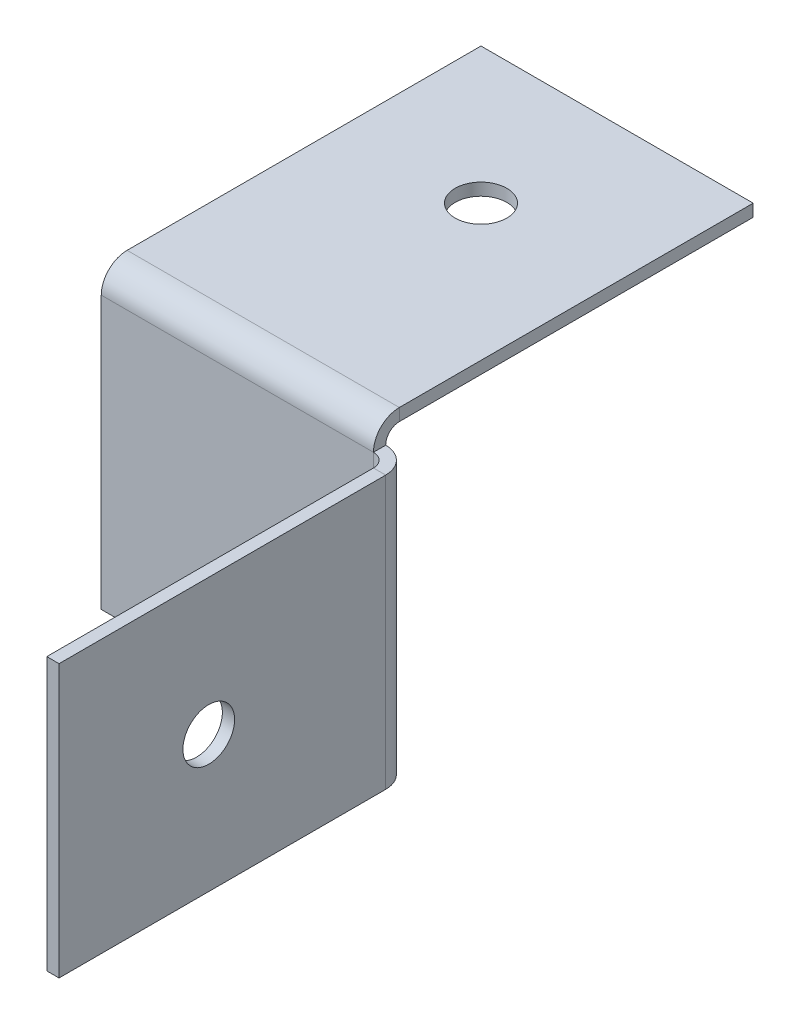
ISO-10303-21;
HEADER;
FILE_DESCRIPTION(('STEP AP214'),'2;1');
FILE_NAME('part.step','',(''),(''),'','','');
FILE_SCHEMA(('AUTOMOTIVE_DESIGN { 1 0 10303 214 1 1 1 1 }'));
ENDSEC;
DATA;
#1=APPLICATION_CONTEXT('core data for automotive mechanical design processes');
#2=APPLICATION_PROTOCOL_DEFINITION('international standard','automotive_design',2000,#1);
#3=PRODUCT_CONTEXT('',#1,'mechanical');
#4=PRODUCT('Part','Part','',(#3));
#5=PRODUCT_RELATED_PRODUCT_CATEGORY('part','',(#4));
#6=PRODUCT_DEFINITION_FORMATION('','',#4);
#7=PRODUCT_DEFINITION_CONTEXT('part definition',#1,'design');
#8=PRODUCT_DEFINITION('design','',#6,#7);
#9=PRODUCT_DEFINITION_SHAPE('','',#8);
#10=(LENGTH_UNIT() NAMED_UNIT(*) SI_UNIT(.MILLI.,.METRE.));
#11=(NAMED_UNIT(*) PLANE_ANGLE_UNIT() SI_UNIT($,.RADIAN.));
#12=(NAMED_UNIT(*) SI_UNIT($,.STERADIAN.) SOLID_ANGLE_UNIT());
#13=UNCERTAINTY_MEASURE_WITH_UNIT(LENGTH_MEASURE(1.E-05),#10,'distance_accuracy_value','');
#14=(GEOMETRIC_REPRESENTATION_CONTEXT(3) GLOBAL_UNCERTAINTY_ASSIGNED_CONTEXT((#13)) GLOBAL_UNIT_ASSIGNED_CONTEXT((#10,
#11,#12)) REPRESENTATION_CONTEXT('',''));
#15=CARTESIAN_POINT('',(0.,0.,0.));
#16=DIRECTION('',(0.,0.,1.));
#17=DIRECTION('',(1.,0.,0.));
#18=AXIS2_PLACEMENT_3D('',#15,#16,#17);
#19=CARTESIAN_POINT('',(-10.,10.,-0.9));
#20=DIRECTION('',(-1.,0.,0.));
#21=DIRECTION('',(0.,-1.,0.));
#22=AXIS2_PLACEMENT_3D('',#19,#20,#21);
#23=PLANE('',#22);
#24=DIRECTION('',(0.,-1.,0.));
#25=VECTOR('',#24,1.);
#26=CARTESIAN_POINT('',(-10.,10.,0.));
#27=LINE('',#26,#25);
#28=CARTESIAN_POINT('',(-10.,10.,0.));
#29=VERTEX_POINT('',#28);
#30=CARTESIAN_POINT('',(-10.,-10.,0.));
#31=VERTEX_POINT('',#30);
#32=EDGE_CURVE('E130',#29,#31,#27,.T.);
#33=ORIENTED_EDGE('',*,*,#32,.F.);
#34=DIRECTION('',(0.,0.,1.));
#35=VECTOR('',#34,1.);
#36=CARTESIAN_POINT('',(-10.,10.,-0.9));
#37=LINE('',#36,#35);
#38=CARTESIAN_POINT('',(-10.,10.,-0.9));
#39=VERTEX_POINT('',#38);
#40=EDGE_CURVE('E13',#39,#29,#37,.T.);
#41=ORIENTED_EDGE('',*,*,#40,.F.);
#42=DIRECTION('',(0.,-1.,0.));
#43=VECTOR('',#42,1.);
#44=CARTESIAN_POINT('',(-10.,10.,-0.9));
#45=LINE('',#44,#43);
#46=CARTESIAN_POINT('',(-10.,-10.,-0.9));
#47=VERTEX_POINT('',#46);
#48=EDGE_CURVE('E152',#39,#47,#45,.T.);
#49=ORIENTED_EDGE('',*,*,#48,.T.);
#50=DIRECTION('',(0.,0.,1.));
#51=VECTOR('',#50,1.);
#52=CARTESIAN_POINT('',(-10.,-10.,-0.9));
#53=LINE('',#52,#51);
#54=EDGE_CURVE('E82',#47,#31,#53,.T.);
#55=ORIENTED_EDGE('',*,*,#54,.T.);
#56=EDGE_LOOP('',(#33,#41,#49,#55));
#57=FACE_BOUND('',#56,.T.);
#58=ADVANCED_FACE('F79',(#57),#23,.T.);
#59=CARTESIAN_POINT('',(-10.,-10.,-0.9));
#60=DIRECTION('',(0.,-1.,0.));
#61=DIRECTION('',(0.,0.,-1.));
#62=AXIS2_PLACEMENT_3D('',#59,#60,#61);
#63=PLANE('',#62);
#64=DIRECTION('',(1.,0.,0.));
#65=VECTOR('',#64,1.);
#66=CARTESIAN_POINT('',(-10.,-10.,0.));
#67=LINE('',#66,#65);
#68=CARTESIAN_POINT('',(10.,-10.,0.));
#69=VERTEX_POINT('',#68);
#70=EDGE_CURVE('E145',#31,#69,#67,.T.);
#71=ORIENTED_EDGE('',*,*,#70,.F.);
#72=ORIENTED_EDGE('',*,*,#54,.F.);
#73=DIRECTION('',(1.,0.,0.));
#74=VECTOR('',#73,1.);
#75=CARTESIAN_POINT('',(-10.,-10.,-0.9));
#76=LINE('',#75,#74);
#77=CARTESIAN_POINT('',(10.,-10.,-0.9));
#78=VERTEX_POINT('',#77);
#79=EDGE_CURVE('E154',#47,#78,#76,.T.);
#80=ORIENTED_EDGE('',*,*,#79,.T.);
#81=DIRECTION('',(0.,0.,1.));
#82=VECTOR('',#81,1.);
#83=CARTESIAN_POINT('',(10.,-10.,-0.9));
#84=LINE('',#83,#82);
#85=EDGE_CURVE('E111',#78,#69,#84,.T.);
#86=ORIENTED_EDGE('',*,*,#85,.T.);
#87=EDGE_LOOP('',(#71,#72,#80,#86));
#88=FACE_BOUND('',#87,.T.);
#89=ADVANCED_FACE('F235',(#88),#63,.T.);
#90=CARTESIAN_POINT('',(0.,0.,-0.9));
#91=DIRECTION('',(0.,0.,1.));
#92=DIRECTION('',(1.,0.,0.));
#93=AXIS2_PLACEMENT_3D('',#90,#91,#92);
#94=PLANE('',#93);
#95=ORIENTED_EDGE('',*,*,#48,.F.);
#96=DIRECTION('',(-1.,0.,0.));
#97=VECTOR('',#96,1.);
#98=CARTESIAN_POINT('',(-10.,10.,-0.9));
#99=LINE('',#98,#97);
#100=CARTESIAN_POINT('',(9.99999999999999,10.,-0.899999999999998));
#101=VERTEX_POINT('',#100);
#102=EDGE_CURVE('E159',#101,#39,#99,.T.);
#103=ORIENTED_EDGE('',*,*,#102,.F.);
#104=DIRECTION('',(0.,1.,0.));
#105=VECTOR('',#104,1.);
#106=CARTESIAN_POINT('',(10.,10.,-0.9));
#107=LINE('',#106,#105);
#108=EDGE_CURVE('E97',#78,#101,#107,.T.);
#109=ORIENTED_EDGE('',*,*,#108,.F.);
#110=ORIENTED_EDGE('',*,*,#79,.F.);
#111=EDGE_LOOP('',(#95,#103,#109,#110));
#112=FACE_BOUND('',#111,.T.);
#113=ADVANCED_FACE('F236',(#112),#94,.F.);
#114=CARTESIAN_POINT('',(0.,0.,0.));
#115=DIRECTION('',(0.,0.,1.));
#116=DIRECTION('',(1.,0.,0.));
#117=AXIS2_PLACEMENT_3D('',#114,#115,#116);
#118=PLANE('',#117);
#119=ORIENTED_EDGE('',*,*,#32,.T.);
#120=ORIENTED_EDGE('',*,*,#70,.T.);
#121=DIRECTION('',(0.,1.,0.));
#122=VECTOR('',#121,1.);
#123=CARTESIAN_POINT('',(10.,10.,0.));
#124=LINE('',#123,#122);
#125=CARTESIAN_POINT('',(10.,10.,0.));
#126=VERTEX_POINT('',#125);
#127=EDGE_CURVE('E150',#69,#126,#124,.T.);
#128=ORIENTED_EDGE('',*,*,#127,.T.);
#129=DIRECTION('',(-1.,0.,0.));
#130=VECTOR('',#129,1.);
#131=CARTESIAN_POINT('',(-10.,10.,0.));
#132=LINE('',#131,#130);
#133=EDGE_CURVE('E122',#126,#29,#132,.T.);
#134=ORIENTED_EDGE('',*,*,#133,.T.);
#135=EDGE_LOOP('',(#119,#120,#128,#134));
#136=FACE_BOUND('',#135,.T.);
#137=ADVANCED_FACE('F148',(#136),#118,.T.);
#138=CARTESIAN_POINT('',(-10.,10.,-1.9));
#139=DIRECTION('',(-1.,0.,0.));
#140=DIRECTION('',(0.,0.,1.));
#141=AXIS2_PLACEMENT_3D('',#138,#139,#140);
#142=PLANE('',#141);
#143=DIRECTION('',(0.,1.,0.));
#144=VECTOR('',#143,1.);
#145=CARTESIAN_POINT('',(-10.,11.9,-1.89999999999999));
#146=LINE('',#145,#144);
#147=CARTESIAN_POINT('',(-10.,11.,-1.9));
#148=VERTEX_POINT('',#147);
#149=CARTESIAN_POINT('',(-10.,11.9,-1.89999999999999));
#150=VERTEX_POINT('',#149);
#151=EDGE_CURVE('E199',#148,#150,#146,.T.);
#152=ORIENTED_EDGE('',*,*,#151,.F.);
#153=CARTESIAN_POINT('',(-10.,10.,-1.9));
#154=DIRECTION('',(1.,0.,0.));
#155=DIRECTION('',(0.,0.,-1.));
#156=AXIS2_PLACEMENT_3D('',#153,#154,#155);
#157=CIRCLE('',#156,0.999999999999999);
#158=EDGE_CURVE('E139',#39,#148,#157,.F.);
#159=ORIENTED_EDGE('',*,*,#158,.F.);
#160=ORIENTED_EDGE('',*,*,#40,.T.);
#161=CARTESIAN_POINT('',(-10.,10.,-1.9));
#162=DIRECTION('',(1.,0.,0.));
#163=DIRECTION('',(0.,0.,-1.));
#164=AXIS2_PLACEMENT_3D('',#161,#162,#163);
#165=CIRCLE('',#164,1.9);
#166=EDGE_CURVE('E118',#29,#150,#165,.F.);
#167=ORIENTED_EDGE('',*,*,#166,.T.);
#168=EDGE_LOOP('',(#152,#159,#160,#167));
#169=FACE_BOUND('',#168,.T.);
#170=ADVANCED_FACE('F136',(#169),#142,.T.);
#171=CARTESIAN_POINT('',(10.,10.,-1.9));
#172=DIRECTION('',(-1.,0.,0.));
#173=DIRECTION('',(0.,0.,1.));
#174=AXIS2_PLACEMENT_3D('',#171,#172,#173);
#175=PLANE('',#174);
#176=CARTESIAN_POINT('',(10.,10.,-1.9));
#177=DIRECTION('',(1.,0.,0.));
#178=DIRECTION('',(0.,0.,-1.));
#179=AXIS2_PLACEMENT_3D('',#176,#177,#178);
#180=CIRCLE('',#179,0.999999999999999);
#181=CARTESIAN_POINT('',(10.,11.,-1.9));
#182=VERTEX_POINT('',#181);
#183=EDGE_CURVE('E203',#182,#101,#180,.T.);
#184=ORIENTED_EDGE('',*,*,#183,.F.);
#185=DIRECTION('',(0.,1.,0.));
#186=VECTOR('',#185,1.);
#187=CARTESIAN_POINT('',(10.,11.,-1.9));
#188=LINE('',#187,#186);
#189=CARTESIAN_POINT('',(10.,11.9,-1.89999999999999));
#190=VERTEX_POINT('',#189);
#191=EDGE_CURVE('E226',#182,#190,#188,.T.);
#192=ORIENTED_EDGE('',*,*,#191,.T.);
#193=CARTESIAN_POINT('',(10.,10.,-1.9));
#194=DIRECTION('',(1.,0.,0.));
#195=DIRECTION('',(0.,0.,-1.));
#196=AXIS2_PLACEMENT_3D('',#193,#194,#195);
#197=CIRCLE('',#196,1.9);
#198=EDGE_CURVE('E131',#190,#126,#197,.T.);
#199=ORIENTED_EDGE('',*,*,#198,.T.);
#200=DIRECTION('',(0.,0.,1.));
#201=VECTOR('',#200,1.);
#202=CARTESIAN_POINT('',(10.,10.,-0.9));
#203=LINE('',#202,#201);
#204=EDGE_CURVE('E88',#101,#126,#203,.T.);
#205=ORIENTED_EDGE('',*,*,#204,.F.);
#206=EDGE_LOOP('',(#184,#192,#199,#205));
#207=FACE_BOUND('',#206,.T.);
#208=ADVANCED_FACE('F361',(#207),#175,.F.);
#209=CARTESIAN_POINT('',(10.,10.,-1.9));
#210=DIRECTION('',(1.,0.,0.));
#211=DIRECTION('',(0.,1.,0.));
#212=AXIS2_PLACEMENT_3D('',#209,#210,#211);
#213=CYLINDRICAL_SURFACE('',#212,1.9);
#214=ORIENTED_EDGE('',*,*,#133,.F.);
#215=ORIENTED_EDGE('',*,*,#198,.F.);
#216=DIRECTION('',(1.,0.,0.));
#217=VECTOR('',#216,1.);
#218=CARTESIAN_POINT('',(0.,11.9,-1.89999999999999));
#219=LINE('',#218,#217);
#220=EDGE_CURVE('E126',#150,#190,#219,.T.);
#221=ORIENTED_EDGE('',*,*,#220,.F.);
#222=ORIENTED_EDGE('',*,*,#166,.F.);
#223=EDGE_LOOP('',(#214,#215,#221,#222));
#224=FACE_BOUND('',#223,.T.);
#225=ADVANCED_FACE('F119',(#224),#213,.T.);
#226=CARTESIAN_POINT('',(10.,10.,-1.9));
#227=DIRECTION('',(1.,0.,0.));
#228=DIRECTION('',(0.,1.,0.));
#229=AXIS2_PLACEMENT_3D('',#226,#227,#228);
#230=CYLINDRICAL_SURFACE('',#229,0.999999999999999);
#231=ORIENTED_EDGE('',*,*,#102,.T.);
#232=ORIENTED_EDGE('',*,*,#158,.T.);
#233=DIRECTION('',(-1.,0.,0.));
#234=VECTOR('',#233,1.);
#235=CARTESIAN_POINT('',(-10.,11.,-1.9));
#236=LINE('',#235,#234);
#237=EDGE_CURVE('E229',#148,#182,#236,.F.);
#238=ORIENTED_EDGE('',*,*,#237,.T.);
#239=ORIENTED_EDGE('',*,*,#183,.T.);
#240=EDGE_LOOP('',(#231,#232,#238,#239));
#241=FACE_BOUND('',#240,.T.);
#242=ADVANCED_FACE('F367',(#241),#230,.F.);
#243=CARTESIAN_POINT('',(10.,11.9,-0.899999999999997));
#244=DIRECTION('',(1.,0.,0.));
#245=DIRECTION('',(0.,0.,-1.));
#246=AXIS2_PLACEMENT_3D('',#243,#244,#245);
#247=PLANE('',#246);
#248=DIRECTION('',(0.,0.,1.));
#249=VECTOR('',#248,1.);
#250=CARTESIAN_POINT('',(10.,11.9,-0.899999999999997));
#251=LINE('',#250,#249);
#252=CARTESIAN_POINT('',(10.,11.9000000000001,-27.9));
#253=VERTEX_POINT('',#252);
#254=EDGE_CURVE('E207',#253,#190,#251,.T.);
#255=ORIENTED_EDGE('',*,*,#254,.T.);
#256=ORIENTED_EDGE('',*,*,#191,.F.);
#257=DIRECTION('',(0.,0.,-1.));
#258=VECTOR('',#257,1.);
#259=CARTESIAN_POINT('',(10.,11.,0.));
#260=LINE('',#259,#258);
#261=CARTESIAN_POINT('',(10.,11.0000000000001,-27.9));
#262=VERTEX_POINT('',#261);
#263=EDGE_CURVE('E216',#262,#182,#260,.F.);
#264=ORIENTED_EDGE('',*,*,#263,.F.);
#265=DIRECTION('',(0.,-1.,0.));
#266=VECTOR('',#265,1.);
#267=CARTESIAN_POINT('',(10.,11.9000000000001,-27.9));
#268=LINE('',#267,#266);
#269=EDGE_CURVE('E200',#253,#262,#268,.T.);
#270=ORIENTED_EDGE('',*,*,#269,.F.);
#271=EDGE_LOOP('',(#255,#256,#264,#270));
#272=FACE_BOUND('',#271,.T.);
#273=ADVANCED_FACE('F370',(#272),#247,.T.);
#274=CARTESIAN_POINT('',(-10.,11.9000000000001,-27.9));
#275=DIRECTION('',(-1.,0.,0.));
#276=DIRECTION('',(0.,0.,1.));
#277=AXIS2_PLACEMENT_3D('',#274,#275,#276);
#278=PLANE('',#277);
#279=DIRECTION('',(0.,0.,1.));
#280=VECTOR('',#279,1.);
#281=CARTESIAN_POINT('',(-10.,11.,0.));
#282=LINE('',#281,#280);
#283=CARTESIAN_POINT('',(-10.,11.0000000000001,-27.9));
#284=VERTEX_POINT('',#283);
#285=EDGE_CURVE('E222',#148,#284,#282,.F.);
#286=ORIENTED_EDGE('',*,*,#285,.F.);
#287=ORIENTED_EDGE('',*,*,#151,.T.);
#288=DIRECTION('',(0.,0.,-1.));
#289=VECTOR('',#288,1.);
#290=CARTESIAN_POINT('',(-10.,11.9000000000001,-27.9));
#291=LINE('',#290,#289);
#292=CARTESIAN_POINT('',(-10.,11.9000000000001,-27.9));
#293=VERTEX_POINT('',#292);
#294=EDGE_CURVE('E213',#150,#293,#291,.T.);
#295=ORIENTED_EDGE('',*,*,#294,.T.);
#296=DIRECTION('',(0.,-1.,0.));
#297=VECTOR('',#296,1.);
#298=CARTESIAN_POINT('',(-10.,11.9000000000001,-27.9));
#299=LINE('',#298,#297);
#300=EDGE_CURVE('E204',#293,#284,#299,.T.);
#301=ORIENTED_EDGE('',*,*,#300,.T.);
#302=EDGE_LOOP('',(#286,#287,#295,#301));
#303=FACE_BOUND('',#302,.T.);
#304=ADVANCED_FACE('F373',(#303),#278,.T.);
#305=CARTESIAN_POINT('',(0.,11.9,0.));
#306=DIRECTION('',(0.,1.,0.));
#307=DIRECTION('',(0.,0.,1.));
#308=AXIS2_PLACEMENT_3D('',#305,#306,#307);
#309=PLANE('',#308);
#310=CARTESIAN_POINT('',(0.,11.9000000000001,-17.9));
#311=DIRECTION('',(0.,1.,0.));
#312=DIRECTION('',(0.,0.,1.));
#313=AXIS2_PLACEMENT_3D('',#310,#311,#312);
#314=CIRCLE('',#313,1.89865);
#315=CARTESIAN_POINT('',(0.,11.9000000000001,-16.00135));
#316=VERTEX_POINT('',#315);
#317=EDGE_CURVE('E193',#316,#316,#314,.T.);
#318=ORIENTED_EDGE('',*,*,#317,.F.);
#319=EDGE_LOOP('',(#318));
#320=FACE_BOUND('',#319,.T.);
#321=ORIENTED_EDGE('',*,*,#294,.F.);
#322=ORIENTED_EDGE('',*,*,#220,.T.);
#323=ORIENTED_EDGE('',*,*,#254,.F.);
#324=DIRECTION('',(1.,0.,0.));
#325=VECTOR('',#324,1.);
#326=CARTESIAN_POINT('',(10.,11.9000000000001,-27.9));
#327=LINE('',#326,#325);
#328=EDGE_CURVE('E210',#293,#253,#327,.T.);
#329=ORIENTED_EDGE('',*,*,#328,.F.);
#330=EDGE_LOOP('',(#321,#322,#323,#329));
#331=FACE_BOUND('',#330,.T.);
#332=ADVANCED_FACE('F376',(#320,#331),#309,.T.);
#333=CARTESIAN_POINT('',(0.,11.,0.));
#334=DIRECTION('',(0.,1.,0.));
#335=DIRECTION('',(0.,0.,1.));
#336=AXIS2_PLACEMENT_3D('',#333,#334,#335);
#337=PLANE('',#336);
#338=CARTESIAN_POINT('',(0.,11.0000000000001,-17.9));
#339=DIRECTION('',(0.,1.,0.));
#340=DIRECTION('',(0.,0.,1.));
#341=AXIS2_PLACEMENT_3D('',#338,#339,#340);
#342=CIRCLE('',#341,1.89865);
#343=CARTESIAN_POINT('',(0.,11.,-16.00135));
#344=VERTEX_POINT('',#343);
#345=EDGE_CURVE('E196',#344,#344,#342,.T.);
#346=ORIENTED_EDGE('',*,*,#345,.T.);
#347=EDGE_LOOP('',(#346));
#348=FACE_BOUND('',#347,.T.);
#349=ORIENTED_EDGE('',*,*,#237,.F.);
#350=ORIENTED_EDGE('',*,*,#285,.T.);
#351=DIRECTION('',(-1.,0.,0.));
#352=VECTOR('',#351,1.);
#353=CARTESIAN_POINT('',(0.,11.0000000000001,-27.9));
#354=LINE('',#353,#352);
#355=EDGE_CURVE('E219',#284,#262,#354,.F.);
#356=ORIENTED_EDGE('',*,*,#355,.T.);
#357=ORIENTED_EDGE('',*,*,#263,.T.);
#358=EDGE_LOOP('',(#349,#350,#356,#357));
#359=FACE_BOUND('',#358,.T.);
#360=ADVANCED_FACE('F382',(#348,#359),#337,.F.);
#361=CARTESIAN_POINT('',(10.,11.9000000000001,-27.9));
#362=DIRECTION('',(0.,0.,-1.));
#363=DIRECTION('',(0.,1.,0.));
#364=AXIS2_PLACEMENT_3D('',#361,#362,#363);
#365=PLANE('',#364);
#366=ORIENTED_EDGE('',*,*,#355,.F.);
#367=ORIENTED_EDGE('',*,*,#300,.F.);
#368=ORIENTED_EDGE('',*,*,#328,.T.);
#369=ORIENTED_EDGE('',*,*,#269,.T.);
#370=EDGE_LOOP('',(#366,#367,#368,#369));
#371=FACE_BOUND('',#370,.T.);
#372=ADVANCED_FACE('F378',(#371),#365,.T.);
#373=CARTESIAN_POINT('',(0.,11.9000000000001,-17.9));
#374=DIRECTION('',(0.,1.,0.));
#375=DIRECTION('',(0.,0.,1.));
#376=AXIS2_PLACEMENT_3D('',#373,#374,#375);
#377=CYLINDRICAL_SURFACE('',#376,1.89865);
#378=ORIENTED_EDGE('',*,*,#317,.T.);
#379=EDGE_LOOP('',(#378));
#380=FACE_BOUND('',#379,.T.);
#381=ORIENTED_EDGE('',*,*,#345,.F.);
#382=EDGE_LOOP('',(#381));
#383=FACE_BOUND('',#382,.T.);
#384=ADVANCED_FACE('F381',(#380,#383),#377,.F.);
#385=CARTESIAN_POINT('',(10.,-10.,0.999999999999999));
#386=DIRECTION('',(0.,-1.,0.));
#387=DIRECTION('',(0.,0.,-1.));
#388=AXIS2_PLACEMENT_3D('',#385,#386,#387);
#389=PLANE('',#388);
#390=DIRECTION('',(-1.,0.,0.));
#391=VECTOR('',#390,1.);
#392=CARTESIAN_POINT('',(11.9,-10.,0.999999999999993));
#393=LINE('',#392,#391);
#394=CARTESIAN_POINT('',(11.,-10.,0.999999999999995));
#395=VERTEX_POINT('',#394);
#396=CARTESIAN_POINT('',(11.9,-10.,0.999999999999992));
#397=VERTEX_POINT('',#396);
#398=EDGE_CURVE('E183',#395,#397,#393,.F.);
#399=ORIENTED_EDGE('',*,*,#398,.F.);
#400=CARTESIAN_POINT('',(10.,-10.,0.999999999999999));
#401=DIRECTION('',(0.,1.,0.));
#402=DIRECTION('',(0.,0.,1.));
#403=AXIS2_PLACEMENT_3D('',#400,#401,#402);
#404=CIRCLE('',#403,1.);
#405=EDGE_CURVE('E173',#69,#395,#404,.F.);
#406=ORIENTED_EDGE('',*,*,#405,.F.);
#407=ORIENTED_EDGE('',*,*,#85,.F.);
#408=CARTESIAN_POINT('',(10.,-10.,0.999999999999999));
#409=DIRECTION('',(0.,1.,0.));
#410=DIRECTION('',(0.,0.,1.));
#411=AXIS2_PLACEMENT_3D('',#408,#409,#410);
#412=CIRCLE('',#411,1.9);
#413=EDGE_CURVE('E187',#78,#397,#412,.F.);
#414=ORIENTED_EDGE('',*,*,#413,.T.);
#415=EDGE_LOOP('',(#399,#406,#407,#414));
#416=FACE_BOUND('',#415,.T.);
#417=ADVANCED_FACE('F179',(#416),#389,.T.);
#418=CARTESIAN_POINT('',(10.,10.,1.));
#419=DIRECTION('',(0.,-1.,0.));
#420=DIRECTION('',(0.,0.,-1.));
#421=AXIS2_PLACEMENT_3D('',#418,#419,#420);
#422=PLANE('',#421);
#423=CARTESIAN_POINT('',(10.,10.,1.));
#424=DIRECTION('',(0.,1.,0.));
#425=DIRECTION('',(0.,0.,1.));
#426=AXIS2_PLACEMENT_3D('',#423,#424,#425);
#427=CIRCLE('',#426,1.);
#428=CARTESIAN_POINT('',(11.,10.,1.));
#429=VERTEX_POINT('',#428);
#430=EDGE_CURVE('E176',#429,#126,#427,.T.);
#431=ORIENTED_EDGE('',*,*,#430,.F.);
#432=DIRECTION('',(-1.,0.,0.));
#433=VECTOR('',#432,1.);
#434=CARTESIAN_POINT('',(11.,10.,0.999999999999999));
#435=LINE('',#434,#433);
#436=CARTESIAN_POINT('',(11.9,10.,0.999999999999996));
#437=VERTEX_POINT('',#436);
#438=EDGE_CURVE('E292',#429,#437,#435,.F.);
#439=ORIENTED_EDGE('',*,*,#438,.T.);
#440=CARTESIAN_POINT('',(10.,10.,1.));
#441=DIRECTION('',(0.,1.,0.));
#442=DIRECTION('',(0.,0.,1.));
#443=AXIS2_PLACEMENT_3D('',#440,#441,#442);
#444=CIRCLE('',#443,1.9);
#445=EDGE_CURVE('E184',#437,#101,#444,.T.);
#446=ORIENTED_EDGE('',*,*,#445,.T.);
#447=ORIENTED_EDGE('',*,*,#204,.T.);
#448=EDGE_LOOP('',(#431,#439,#446,#447));
#449=FACE_BOUND('',#448,.T.);
#450=ADVANCED_FACE('F293',(#449),#422,.F.);
#451=CARTESIAN_POINT('',(10.,10.,1.));
#452=DIRECTION('',(0.,1.,0.));
#453=DIRECTION('',(1.,0.,0.));
#454=AXIS2_PLACEMENT_3D('',#451,#452,#453);
#455=CYLINDRICAL_SURFACE('',#454,1.9);
#456=ORIENTED_EDGE('',*,*,#108,.T.);
#457=ORIENTED_EDGE('',*,*,#445,.F.);
#458=DIRECTION('',(0.,1.,0.));
#459=VECTOR('',#458,1.);
#460=CARTESIAN_POINT('',(11.9,-10.,0.999999999999993));
#461=LINE('',#460,#459);
#462=EDGE_CURVE('E289',#437,#397,#461,.F.);
#463=ORIENTED_EDGE('',*,*,#462,.T.);
#464=ORIENTED_EDGE('',*,*,#413,.F.);
#465=EDGE_LOOP('',(#456,#457,#463,#464));
#466=FACE_BOUND('',#465,.T.);
#467=ADVANCED_FACE('F287',(#466),#455,.T.);
#468=CARTESIAN_POINT('',(10.,10.,1.));
#469=DIRECTION('',(0.,1.,0.));
#470=DIRECTION('',(1.,0.,0.));
#471=AXIS2_PLACEMENT_3D('',#468,#469,#470);
#472=CYLINDRICAL_SURFACE('',#471,1.);
#473=ORIENTED_EDGE('',*,*,#127,.F.);
#474=ORIENTED_EDGE('',*,*,#405,.T.);
#475=DIRECTION('',(0.,1.,0.));
#476=VECTOR('',#475,1.);
#477=CARTESIAN_POINT('',(11.,-10.,0.999999999999996));
#478=LINE('',#477,#476);
#479=EDGE_CURVE('E297',#395,#429,#478,.T.);
#480=ORIENTED_EDGE('',*,*,#479,.T.);
#481=ORIENTED_EDGE('',*,*,#430,.T.);
#482=EDGE_LOOP('',(#473,#474,#480,#481));
#483=FACE_BOUND('',#482,.T.);
#484=ADVANCED_FACE('F170',(#483),#472,.F.);
#485=CARTESIAN_POINT('',(11.9,-10.,0.));
#486=DIRECTION('',(0.,1.,0.));
#487=DIRECTION('',(-1.,0.,0.));
#488=AXIS2_PLACEMENT_3D('',#485,#486,#487);
#489=PLANE('',#488);
#490=ORIENTED_EDGE('',*,*,#398,.T.);
#491=DIRECTION('',(0.,0.,-1.));
#492=VECTOR('',#491,1.);
#493=CARTESIAN_POINT('',(11.9,-10.,0.));
#494=LINE('',#493,#492);
#495=CARTESIAN_POINT('',(11.9000000000001,-10.,25.));
#496=VERTEX_POINT('',#495);
#497=EDGE_CURVE('E303',#496,#397,#494,.T.);
#498=ORIENTED_EDGE('',*,*,#497,.F.);
#499=DIRECTION('',(-1.,0.,0.));
#500=VECTOR('',#499,1.);
#501=CARTESIAN_POINT('',(11.9000000000001,-10.,25.));
#502=LINE('',#501,#500);
#503=CARTESIAN_POINT('',(11.0000000000001,-10.,25.));
#504=VERTEX_POINT('',#503);
#505=EDGE_CURVE('E309',#496,#504,#502,.T.);
#506=ORIENTED_EDGE('',*,*,#505,.T.);
#507=DIRECTION('',(0.,0.,1.));
#508=VECTOR('',#507,1.);
#509=CARTESIAN_POINT('',(11.,-10.,0.));
#510=LINE('',#509,#508);
#511=EDGE_CURVE('E304',#504,#395,#510,.F.);
#512=ORIENTED_EDGE('',*,*,#511,.T.);
#513=EDGE_LOOP('',(#490,#498,#506,#512));
#514=FACE_BOUND('',#513,.T.);
#515=ADVANCED_FACE('F323',(#514),#489,.F.);
#516=CARTESIAN_POINT('',(11.9000000000001,10.,25.));
#517=DIRECTION('',(0.,-1.,0.));
#518=DIRECTION('',(1.,0.,0.));
#519=AXIS2_PLACEMENT_3D('',#516,#517,#518);
#520=PLANE('',#519);
#521=ORIENTED_EDGE('',*,*,#438,.F.);
#522=DIRECTION('',(0.,0.,-1.));
#523=VECTOR('',#522,1.);
#524=CARTESIAN_POINT('',(11.0000000000001,10.,25.));
#525=LINE('',#524,#523);
#526=CARTESIAN_POINT('',(11.0000000000001,10.,25.));
#527=VERTEX_POINT('',#526);
#528=EDGE_CURVE('E316',#429,#527,#525,.F.);
#529=ORIENTED_EDGE('',*,*,#528,.T.);
#530=DIRECTION('',(-1.,0.,0.));
#531=VECTOR('',#530,1.);
#532=CARTESIAN_POINT('',(11.9000000000001,10.,25.));
#533=LINE('',#532,#531);
#534=CARTESIAN_POINT('',(11.9000000000001,10.,25.));
#535=VERTEX_POINT('',#534);
#536=EDGE_CURVE('E189',#535,#527,#533,.T.);
#537=ORIENTED_EDGE('',*,*,#536,.F.);
#538=DIRECTION('',(0.,0.,1.));
#539=VECTOR('',#538,1.);
#540=CARTESIAN_POINT('',(11.9,10.,0.));
#541=LINE('',#540,#539);
#542=EDGE_CURVE('E300',#437,#535,#541,.T.);
#543=ORIENTED_EDGE('',*,*,#542,.F.);
#544=EDGE_LOOP('',(#521,#529,#537,#543));
#545=FACE_BOUND('',#544,.T.);
#546=ADVANCED_FACE('F306',(#545),#520,.F.);
#547=CARTESIAN_POINT('',(11.9,0.,0.));
#548=DIRECTION('',(-1.,0.,0.));
#549=DIRECTION('',(0.,0.,1.));
#550=AXIS2_PLACEMENT_3D('',#547,#548,#549);
#551=PLANE('',#550);
#552=CARTESIAN_POINT('',(11.9000000000002,0.,14.));
#553=DIRECTION('',(-1.,0.,0.));
#554=DIRECTION('',(0.,0.,1.));
#555=AXIS2_PLACEMENT_3D('',#552,#553,#554);
#556=CIRCLE('',#555,1.89865);
#557=CARTESIAN_POINT('',(11.9000000000002,0.,15.89865));
#558=VERTEX_POINT('',#557);
#559=EDGE_CURVE('E321',#558,#558,#556,.T.);
#560=ORIENTED_EDGE('',*,*,#559,.T.);
#561=EDGE_LOOP('',(#560));
#562=FACE_BOUND('',#561,.T.);
#563=ORIENTED_EDGE('',*,*,#462,.F.);
#564=ORIENTED_EDGE('',*,*,#542,.T.);
#565=DIRECTION('',(0.,-1.,0.));
#566=VECTOR('',#565,1.);
#567=CARTESIAN_POINT('',(11.9000000000001,0.,25.));
#568=LINE('',#567,#566);
#569=EDGE_CURVE('E274',#535,#496,#568,.T.);
#570=ORIENTED_EDGE('',*,*,#569,.T.);
#571=ORIENTED_EDGE('',*,*,#497,.T.);
#572=EDGE_LOOP('',(#563,#564,#570,#571));
#573=FACE_BOUND('',#572,.T.);
#574=ADVANCED_FACE('F299',(#562,#573),#551,.F.);
#575=CARTESIAN_POINT('',(11.,0.,0.));
#576=DIRECTION('',(-1.,0.,0.));
#577=DIRECTION('',(0.,0.,1.));
#578=AXIS2_PLACEMENT_3D('',#575,#576,#577);
#579=PLANE('',#578);
#580=CARTESIAN_POINT('',(11.,0.,14.));
#581=DIRECTION('',(-1.,0.,0.));
#582=DIRECTION('',(0.,0.,1.));
#583=AXIS2_PLACEMENT_3D('',#580,#581,#582);
#584=CIRCLE('',#583,1.89864999999999);
#585=CARTESIAN_POINT('',(11.,0.,15.89865));
#586=VERTEX_POINT('',#585);
#587=EDGE_CURVE('E335',#586,#586,#584,.T.);
#588=ORIENTED_EDGE('',*,*,#587,.F.);
#589=EDGE_LOOP('',(#588));
#590=FACE_BOUND('',#589,.T.);
#591=ORIENTED_EDGE('',*,*,#528,.F.);
#592=ORIENTED_EDGE('',*,*,#479,.F.);
#593=ORIENTED_EDGE('',*,*,#511,.F.);
#594=DIRECTION('',(0.,1.,0.));
#595=VECTOR('',#594,1.);
#596=CARTESIAN_POINT('',(11.0000000000001,-10.,25.));
#597=LINE('',#596,#595);
#598=EDGE_CURVE('E311',#527,#504,#597,.F.);
#599=ORIENTED_EDGE('',*,*,#598,.F.);
#600=EDGE_LOOP('',(#591,#592,#593,#599));
#601=FACE_BOUND('',#600,.T.);
#602=ADVANCED_FACE('F328',(#590,#601),#579,.T.);
#603=CARTESIAN_POINT('',(11.9000000000001,-10.,25.));
#604=DIRECTION('',(0.,0.,-1.));
#605=DIRECTION('',(-1.,0.,0.));
#606=AXIS2_PLACEMENT_3D('',#603,#604,#605);
#607=PLANE('',#606);
#608=ORIENTED_EDGE('',*,*,#598,.T.);
#609=ORIENTED_EDGE('',*,*,#505,.F.);
#610=ORIENTED_EDGE('',*,*,#569,.F.);
#611=ORIENTED_EDGE('',*,*,#536,.T.);
#612=EDGE_LOOP('',(#608,#609,#610,#611));
#613=FACE_BOUND('',#612,.T.);
#614=ADVANCED_FACE('F330',(#613),#607,.F.);
#615=CARTESIAN_POINT('',(11.,0.,14.));
#616=DIRECTION('',(-1.,0.,0.));
#617=DIRECTION('',(0.,0.,1.));
#618=AXIS2_PLACEMENT_3D('',#615,#616,#617);
#619=CYLINDRICAL_SURFACE('',#618,1.89864999999999);
#620=ORIENTED_EDGE('',*,*,#559,.F.);
#621=EDGE_LOOP('',(#620));
#622=FACE_BOUND('',#621,.T.);
#623=ORIENTED_EDGE('',*,*,#587,.T.);
#624=EDGE_LOOP('',(#623));
#625=FACE_BOUND('',#624,.T.);
#626=ADVANCED_FACE('F339',(#622,#625),#619,.F.);
#627=CLOSED_SHELL('',(#58,#89,#113,#137,#170,#208,#225,#242,#273,#304,#332,#360,#372,#384,#417,
#450,#467,#484,#515,#546,#574,#602,#614,#626));
#628=MANIFOLD_SOLID_BREP('B2',#627);
#629=ADVANCED_BREP_SHAPE_REPRESENTATION('',(#18,#628),#14);
#630=SHAPE_DEFINITION_REPRESENTATION(#9,#629);
ENDSEC;
END-ISO-10303-21;
